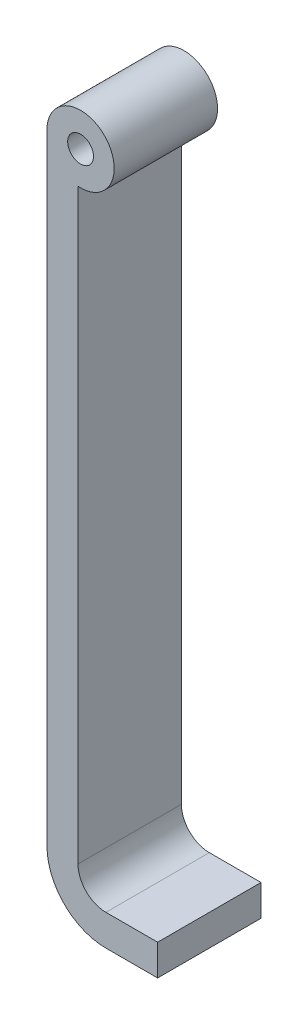
ISO-10303-21;
HEADER;
FILE_DESCRIPTION(('STEP AP214'),'2;1');
FILE_NAME('part.step','',(''),(''),'','','');
FILE_SCHEMA(('AUTOMOTIVE_DESIGN { 1 0 10303 214 1 1 1 1 }'));
ENDSEC;
DATA;
#1=APPLICATION_CONTEXT('core data for automotive mechanical design processes');
#2=APPLICATION_PROTOCOL_DEFINITION('international standard','automotive_design',2000,#1);
#3=PRODUCT_CONTEXT('',#1,'mechanical');
#4=PRODUCT('Part','Part','',(#3));
#5=PRODUCT_RELATED_PRODUCT_CATEGORY('part','',(#4));
#6=PRODUCT_DEFINITION_FORMATION('','',#4);
#7=PRODUCT_DEFINITION_CONTEXT('part definition',#1,'design');
#8=PRODUCT_DEFINITION('design','',#6,#7);
#9=PRODUCT_DEFINITION_SHAPE('','',#8);
#10=(LENGTH_UNIT() NAMED_UNIT(*) SI_UNIT(.MILLI.,.METRE.));
#11=(NAMED_UNIT(*) PLANE_ANGLE_UNIT() SI_UNIT($,.RADIAN.));
#12=(NAMED_UNIT(*) SI_UNIT($,.STERADIAN.) SOLID_ANGLE_UNIT());
#13=UNCERTAINTY_MEASURE_WITH_UNIT(LENGTH_MEASURE(1.E-05),#10,'distance_accuracy_value','');
#14=(GEOMETRIC_REPRESENTATION_CONTEXT(3) GLOBAL_UNCERTAINTY_ASSIGNED_CONTEXT((#13)) GLOBAL_UNIT_ASSIGNED_CONTEXT((#10,
#11,#12)) REPRESENTATION_CONTEXT('',''));
#15=CARTESIAN_POINT('',(0.,0.,0.));
#16=DIRECTION('',(0.,0.,1.));
#17=DIRECTION('',(1.,0.,0.));
#18=AXIS2_PLACEMENT_3D('',#15,#16,#17);
#19=CARTESIAN_POINT('',(0.,0.,10.));
#20=DIRECTION('',(0.,0.,1.));
#21=DIRECTION('',(1.,0.,0.));
#22=AXIS2_PLACEMENT_3D('',#19,#20,#21);
#23=PLANE('',#22);
#24=CARTESIAN_POINT('',(0.,0.,10.));
#25=DIRECTION('',(0.,0.,1.));
#26=DIRECTION('',(1.,0.,0.));
#27=AXIS2_PLACEMENT_3D('',#24,#25,#26);
#28=CIRCLE('',#27,3.25);
#29=CARTESIAN_POINT('',(-0.250000000000007,-3.24037034920393,10.));
#30=VERTEX_POINT('',#29);
#31=CARTESIAN_POINT('',(-3.25,0.,10.));
#32=VERTEX_POINT('',#31);
#33=EDGE_CURVE('E164',#30,#32,#28,.T.);
#34=ORIENTED_EDGE('',*,*,#33,.T.);
#35=DIRECTION('',(0.,-1.,0.));
#36=VECTOR('',#35,1.);
#37=CARTESIAN_POINT('',(-3.25,0.,10.));
#38=LINE('',#37,#36);
#39=CARTESIAN_POINT('',(-3.24999999999999,-60.,10.));
#40=VERTEX_POINT('',#39);
#41=EDGE_CURVE('E100',#32,#40,#38,.T.);
#42=ORIENTED_EDGE('',*,*,#41,.T.);
#43=CARTESIAN_POINT('',(2.45000000000001,-60.,10.));
#44=DIRECTION('',(0.,0.,1.));
#45=DIRECTION('',(1.,0.,0.));
#46=AXIS2_PLACEMENT_3D('',#43,#44,#45);
#47=CIRCLE('',#46,5.7);
#48=CARTESIAN_POINT('',(2.45000000000001,-65.7,10.));
#49=VERTEX_POINT('',#48);
#50=EDGE_CURVE('E185',#40,#49,#47,.T.);
#51=ORIENTED_EDGE('',*,*,#50,.T.);
#52=DIRECTION('',(1.,0.,0.));
#53=VECTOR('',#52,1.);
#54=CARTESIAN_POINT('',(7.45000000000001,-65.7,10.));
#55=LINE('',#54,#53);
#56=CARTESIAN_POINT('',(7.45000000000001,-65.7,10.));
#57=VERTEX_POINT('',#56);
#58=EDGE_CURVE('E199',#49,#57,#55,.T.);
#59=ORIENTED_EDGE('',*,*,#58,.T.);
#60=DIRECTION('',(0.,1.,0.));
#61=VECTOR('',#60,1.);
#62=CARTESIAN_POINT('',(7.45000000000001,-62.7,10.));
#63=LINE('',#62,#61);
#64=CARTESIAN_POINT('',(7.45000000000001,-62.7,10.));
#65=VERTEX_POINT('',#64);
#66=EDGE_CURVE('E119',#57,#65,#63,.T.);
#67=ORIENTED_EDGE('',*,*,#66,.T.);
#68=DIRECTION('',(-1.,0.,0.));
#69=VECTOR('',#68,1.);
#70=CARTESIAN_POINT('',(2.45000000000001,-62.7,10.));
#71=LINE('',#70,#69);
#72=CARTESIAN_POINT('',(2.45000000000001,-62.7,10.));
#73=VERTEX_POINT('',#72);
#74=EDGE_CURVE('E113',#65,#73,#71,.T.);
#75=ORIENTED_EDGE('',*,*,#74,.T.);
#76=CARTESIAN_POINT('',(2.45000000000001,-60.,10.));
#77=DIRECTION('',(0.,0.,-1.));
#78=DIRECTION('',(1.,0.,0.));
#79=AXIS2_PLACEMENT_3D('',#76,#77,#78);
#80=CIRCLE('',#79,2.7);
#81=CARTESIAN_POINT('',(-0.24999999999999,-60.,10.));
#82=VERTEX_POINT('',#81);
#83=EDGE_CURVE('E117',#73,#82,#80,.T.);
#84=ORIENTED_EDGE('',*,*,#83,.T.);
#85=DIRECTION('',(0.,1.,0.));
#86=VECTOR('',#85,1.);
#87=CARTESIAN_POINT('',(-0.249999999999993,-60.,10.));
#88=LINE('',#87,#86);
#89=EDGE_CURVE('E57',#82,#30,#88,.T.);
#90=ORIENTED_EDGE('',*,*,#89,.T.);
#91=EDGE_LOOP('',(#34,#42,#51,#59,#67,#75,#84,#90));
#92=FACE_BOUND('',#91,.T.);
#93=CARTESIAN_POINT('',(0.,0.,10.));
#94=DIRECTION('',(0.,0.,1.));
#95=DIRECTION('',(1.,0.,0.));
#96=AXIS2_PLACEMENT_3D('',#93,#94,#95);
#97=CIRCLE('',#96,1.25);
#98=CARTESIAN_POINT('',(1.25,0.,10.));
#99=VERTEX_POINT('',#98);
#100=EDGE_CURVE('E146',#99,#99,#97,.T.);
#101=ORIENTED_EDGE('',*,*,#100,.F.);
#102=EDGE_LOOP('',(#101));
#103=FACE_BOUND('',#102,.T.);
#104=ADVANCED_FACE('F39',(#92,#103),#23,.T.);
#105=CARTESIAN_POINT('',(0.,0.,0.));
#106=DIRECTION('',(0.,0.,1.));
#107=DIRECTION('',(1.,0.,0.));
#108=AXIS2_PLACEMENT_3D('',#105,#106,#107);
#109=PLANE('',#108);
#110=CARTESIAN_POINT('',(0.,0.,0.));
#111=DIRECTION('',(0.,0.,1.));
#112=DIRECTION('',(1.,0.,0.));
#113=AXIS2_PLACEMENT_3D('',#110,#111,#112);
#114=CIRCLE('',#113,3.25);
#115=CARTESIAN_POINT('',(-0.250000000000007,-3.24037034920393,0.));
#116=VERTEX_POINT('',#115);
#117=CARTESIAN_POINT('',(-3.25,0.,0.));
#118=VERTEX_POINT('',#117);
#119=EDGE_CURVE('E141',#116,#118,#114,.T.);
#120=ORIENTED_EDGE('',*,*,#119,.F.);
#121=DIRECTION('',(0.,1.,0.));
#122=VECTOR('',#121,1.);
#123=CARTESIAN_POINT('',(-0.249999999999993,-60.,0.));
#124=LINE('',#123,#122);
#125=CARTESIAN_POINT('',(-0.24999999999999,-60.,0.));
#126=VERTEX_POINT('',#125);
#127=EDGE_CURVE('E92',#126,#116,#124,.T.);
#128=ORIENTED_EDGE('',*,*,#127,.F.);
#129=CARTESIAN_POINT('',(2.45000000000001,-60.,0.));
#130=DIRECTION('',(0.,0.,-1.));
#131=DIRECTION('',(1.,0.,0.));
#132=AXIS2_PLACEMENT_3D('',#129,#130,#131);
#133=CIRCLE('',#132,2.7);
#134=CARTESIAN_POINT('',(2.45000000000001,-62.7,0.));
#135=VERTEX_POINT('',#134);
#136=EDGE_CURVE('E86',#135,#126,#133,.T.);
#137=ORIENTED_EDGE('',*,*,#136,.F.);
#138=DIRECTION('',(-1.,0.,0.));
#139=VECTOR('',#138,1.);
#140=CARTESIAN_POINT('',(2.45000000000001,-62.7,0.));
#141=LINE('',#140,#139);
#142=CARTESIAN_POINT('',(7.45000000000001,-62.7,0.));
#143=VERTEX_POINT('',#142);
#144=EDGE_CURVE('E128',#143,#135,#141,.T.);
#145=ORIENTED_EDGE('',*,*,#144,.F.);
#146=DIRECTION('',(0.,1.,0.));
#147=VECTOR('',#146,1.);
#148=CARTESIAN_POINT('',(7.45000000000001,-62.7,0.));
#149=LINE('',#148,#147);
#150=CARTESIAN_POINT('',(7.45000000000001,-65.7,0.));
#151=VERTEX_POINT('',#150);
#152=EDGE_CURVE('E155',#151,#143,#149,.T.);
#153=ORIENTED_EDGE('',*,*,#152,.F.);
#154=DIRECTION('',(1.,0.,0.));
#155=VECTOR('',#154,1.);
#156=CARTESIAN_POINT('',(7.45000000000001,-65.7,0.));
#157=LINE('',#156,#155);
#158=CARTESIAN_POINT('',(2.45000000000001,-65.7,0.));
#159=VERTEX_POINT('',#158);
#160=EDGE_CURVE('E152',#159,#151,#157,.T.);
#161=ORIENTED_EDGE('',*,*,#160,.F.);
#162=CARTESIAN_POINT('',(2.45000000000001,-60.,0.));
#163=DIRECTION('',(0.,0.,1.));
#164=DIRECTION('',(1.,0.,0.));
#165=AXIS2_PLACEMENT_3D('',#162,#163,#164);
#166=CIRCLE('',#165,5.7);
#167=CARTESIAN_POINT('',(-3.24999999999999,-60.,0.));
#168=VERTEX_POINT('',#167);
#169=EDGE_CURVE('E149',#168,#159,#166,.T.);
#170=ORIENTED_EDGE('',*,*,#169,.F.);
#171=DIRECTION('',(0.,-1.,0.));
#172=VECTOR('',#171,1.);
#173=CARTESIAN_POINT('',(-3.25,0.,0.));
#174=LINE('',#173,#172);
#175=EDGE_CURVE('E145',#118,#168,#174,.T.);
#176=ORIENTED_EDGE('',*,*,#175,.F.);
#177=EDGE_LOOP('',(#120,#128,#137,#145,#153,#161,#170,#176));
#178=FACE_BOUND('',#177,.T.);
#179=CARTESIAN_POINT('',(0.,0.,0.));
#180=DIRECTION('',(0.,0.,1.));
#181=DIRECTION('',(1.,0.,0.));
#182=AXIS2_PLACEMENT_3D('',#179,#180,#181);
#183=CIRCLE('',#182,1.25);
#184=CARTESIAN_POINT('',(1.25,0.,0.));
#185=VERTEX_POINT('',#184);
#186=EDGE_CURVE('E209',#185,#185,#183,.T.);
#187=ORIENTED_EDGE('',*,*,#186,.T.);
#188=EDGE_LOOP('',(#187));
#189=FACE_BOUND('',#188,.T.);
#190=ADVANCED_FACE('F189',(#178,#189),#109,.F.);
#191=CARTESIAN_POINT('',(0.,0.,10.));
#192=DIRECTION('',(0.,0.,-1.));
#193=DIRECTION('',(-1.,0.,0.));
#194=AXIS2_PLACEMENT_3D('',#191,#192,#193);
#195=CYLINDRICAL_SURFACE('',#194,3.25);
#196=ORIENTED_EDGE('',*,*,#119,.T.);
#197=DIRECTION('',(0.,0.,-1.));
#198=VECTOR('',#197,1.);
#199=CARTESIAN_POINT('',(-3.25,0.,10.));
#200=LINE('',#199,#198);
#201=EDGE_CURVE('E11',#32,#118,#200,.T.);
#202=ORIENTED_EDGE('',*,*,#201,.F.);
#203=ORIENTED_EDGE('',*,*,#33,.F.);
#204=DIRECTION('',(0.,0.,-1.));
#205=VECTOR('',#204,1.);
#206=CARTESIAN_POINT('',(-0.250000000000007,-3.24037034920393,10.));
#207=LINE('',#206,#205);
#208=EDGE_CURVE('E137',#30,#116,#207,.T.);
#209=ORIENTED_EDGE('',*,*,#208,.T.);
#210=EDGE_LOOP('',(#196,#202,#203,#209));
#211=FACE_BOUND('',#210,.T.);
#212=ADVANCED_FACE('F41',(#211),#195,.T.);
#213=CARTESIAN_POINT('',(-3.25,0.,10.));
#214=DIRECTION('',(1.,0.,0.));
#215=DIRECTION('',(0.,1.,0.));
#216=AXIS2_PLACEMENT_3D('',#213,#214,#215);
#217=PLANE('',#216);
#218=ORIENTED_EDGE('',*,*,#175,.T.);
#219=DIRECTION('',(0.,0.,-1.));
#220=VECTOR('',#219,1.);
#221=CARTESIAN_POINT('',(-3.24999999999999,-60.,10.));
#222=LINE('',#221,#220);
#223=EDGE_CURVE('E49',#40,#168,#222,.T.);
#224=ORIENTED_EDGE('',*,*,#223,.F.);
#225=ORIENTED_EDGE('',*,*,#41,.F.);
#226=ORIENTED_EDGE('',*,*,#201,.T.);
#227=EDGE_LOOP('',(#218,#224,#225,#226));
#228=FACE_BOUND('',#227,.T.);
#229=ADVANCED_FACE('F239',(#228),#217,.F.);
#230=CARTESIAN_POINT('',(2.45000000000001,-60.,10.));
#231=DIRECTION('',(0.,0.,-1.));
#232=DIRECTION('',(-1.,0.,0.));
#233=AXIS2_PLACEMENT_3D('',#230,#231,#232);
#234=CYLINDRICAL_SURFACE('',#233,5.7);
#235=ORIENTED_EDGE('',*,*,#169,.T.);
#236=DIRECTION('',(0.,0.,-1.));
#237=VECTOR('',#236,1.);
#238=CARTESIAN_POINT('',(2.45000000000001,-65.7,10.));
#239=LINE('',#238,#237);
#240=EDGE_CURVE('E175',#49,#159,#239,.T.);
#241=ORIENTED_EDGE('',*,*,#240,.F.);
#242=ORIENTED_EDGE('',*,*,#50,.F.);
#243=ORIENTED_EDGE('',*,*,#223,.T.);
#244=EDGE_LOOP('',(#235,#241,#242,#243));
#245=FACE_BOUND('',#244,.T.);
#246=ADVANCED_FACE('F183',(#245),#234,.T.);
#247=CARTESIAN_POINT('',(7.45000000000001,-65.7,10.));
#248=DIRECTION('',(0.,1.,0.));
#249=DIRECTION('',(0.,0.,1.));
#250=AXIS2_PLACEMENT_3D('',#247,#248,#249);
#251=PLANE('',#250);
#252=ORIENTED_EDGE('',*,*,#160,.T.);
#253=DIRECTION('',(0.,0.,-1.));
#254=VECTOR('',#253,1.);
#255=CARTESIAN_POINT('',(7.45000000000001,-65.7,10.));
#256=LINE('',#255,#254);
#257=EDGE_CURVE('E171',#57,#151,#256,.T.);
#258=ORIENTED_EDGE('',*,*,#257,.F.);
#259=ORIENTED_EDGE('',*,*,#58,.F.);
#260=ORIENTED_EDGE('',*,*,#240,.T.);
#261=EDGE_LOOP('',(#252,#258,#259,#260));
#262=FACE_BOUND('',#261,.T.);
#263=ADVANCED_FACE('F194',(#262),#251,.F.);
#264=CARTESIAN_POINT('',(7.45000000000001,-62.7,10.));
#265=DIRECTION('',(-1.,0.,0.));
#266=DIRECTION('',(0.,-1.,0.));
#267=AXIS2_PLACEMENT_3D('',#264,#265,#266);
#268=PLANE('',#267);
#269=ORIENTED_EDGE('',*,*,#152,.T.);
#270=DIRECTION('',(0.,0.,-1.));
#271=VECTOR('',#270,1.);
#272=CARTESIAN_POINT('',(7.45000000000001,-62.7,10.));
#273=LINE('',#272,#271);
#274=EDGE_CURVE('E130',#65,#143,#273,.T.);
#275=ORIENTED_EDGE('',*,*,#274,.F.);
#276=ORIENTED_EDGE('',*,*,#66,.F.);
#277=ORIENTED_EDGE('',*,*,#257,.T.);
#278=EDGE_LOOP('',(#269,#275,#276,#277));
#279=FACE_BOUND('',#278,.T.);
#280=ADVANCED_FACE('F197',(#279),#268,.F.);
#281=CARTESIAN_POINT('',(2.45000000000001,-62.7,10.));
#282=DIRECTION('',(0.,-1.,0.));
#283=DIRECTION('',(0.,0.,-1.));
#284=AXIS2_PLACEMENT_3D('',#281,#282,#283);
#285=PLANE('',#284);
#286=ORIENTED_EDGE('',*,*,#144,.T.);
#287=DIRECTION('',(0.,0.,-1.));
#288=VECTOR('',#287,1.);
#289=CARTESIAN_POINT('',(2.45000000000001,-62.7,10.));
#290=LINE('',#289,#288);
#291=EDGE_CURVE('E125',#73,#135,#290,.T.);
#292=ORIENTED_EDGE('',*,*,#291,.F.);
#293=ORIENTED_EDGE('',*,*,#74,.F.);
#294=ORIENTED_EDGE('',*,*,#274,.T.);
#295=EDGE_LOOP('',(#286,#292,#293,#294));
#296=FACE_BOUND('',#295,.T.);
#297=ADVANCED_FACE('F126',(#296),#285,.F.);
#298=CARTESIAN_POINT('',(2.45000000000001,-60.,10.));
#299=DIRECTION('',(0.,0.,-1.));
#300=DIRECTION('',(-1.,0.,0.));
#301=AXIS2_PLACEMENT_3D('',#298,#299,#300);
#302=CYLINDRICAL_SURFACE('',#301,2.7);
#303=ORIENTED_EDGE('',*,*,#136,.T.);
#304=DIRECTION('',(0.,0.,-1.));
#305=VECTOR('',#304,1.);
#306=CARTESIAN_POINT('',(-0.24999999999999,-60.,10.));
#307=LINE('',#306,#305);
#308=EDGE_CURVE('E131',#82,#126,#307,.T.);
#309=ORIENTED_EDGE('',*,*,#308,.F.);
#310=ORIENTED_EDGE('',*,*,#83,.F.);
#311=ORIENTED_EDGE('',*,*,#291,.T.);
#312=EDGE_LOOP('',(#303,#309,#310,#311));
#313=FACE_BOUND('',#312,.T.);
#314=ADVANCED_FACE('F133',(#313),#302,.F.);
#315=CARTESIAN_POINT('',(-0.249999999999993,-60.,10.));
#316=DIRECTION('',(-1.,0.,0.));
#317=DIRECTION('',(0.,-1.,0.));
#318=AXIS2_PLACEMENT_3D('',#315,#316,#317);
#319=PLANE('',#318);
#320=ORIENTED_EDGE('',*,*,#127,.T.);
#321=ORIENTED_EDGE('',*,*,#208,.F.);
#322=ORIENTED_EDGE('',*,*,#89,.F.);
#323=ORIENTED_EDGE('',*,*,#308,.T.);
#324=EDGE_LOOP('',(#320,#321,#322,#323));
#325=FACE_BOUND('',#324,.T.);
#326=ADVANCED_FACE('F227',(#325),#319,.F.);
#327=CARTESIAN_POINT('',(0.,0.,10.));
#328=DIRECTION('',(0.,0.,-1.));
#329=DIRECTION('',(-1.,0.,0.));
#330=AXIS2_PLACEMENT_3D('',#327,#328,#329);
#331=CYLINDRICAL_SURFACE('',#330,1.25);
#332=ORIENTED_EDGE('',*,*,#100,.T.);
#333=EDGE_LOOP('',(#332));
#334=FACE_BOUND('',#333,.T.);
#335=ORIENTED_EDGE('',*,*,#186,.F.);
#336=EDGE_LOOP('',(#335));
#337=FACE_BOUND('',#336,.T.);
#338=ADVANCED_FACE('F217',(#334,#337),#331,.F.);
#339=CLOSED_SHELL('',(#104,#190,#212,#229,#246,#263,#280,#297,#314,#326,#338));
#340=MANIFOLD_SOLID_BREP('B2',#339);
#341=ADVANCED_BREP_SHAPE_REPRESENTATION('',(#18,#340),#14);
#342=SHAPE_DEFINITION_REPRESENTATION(#9,#341);
ENDSEC;
END-ISO-10303-21;
